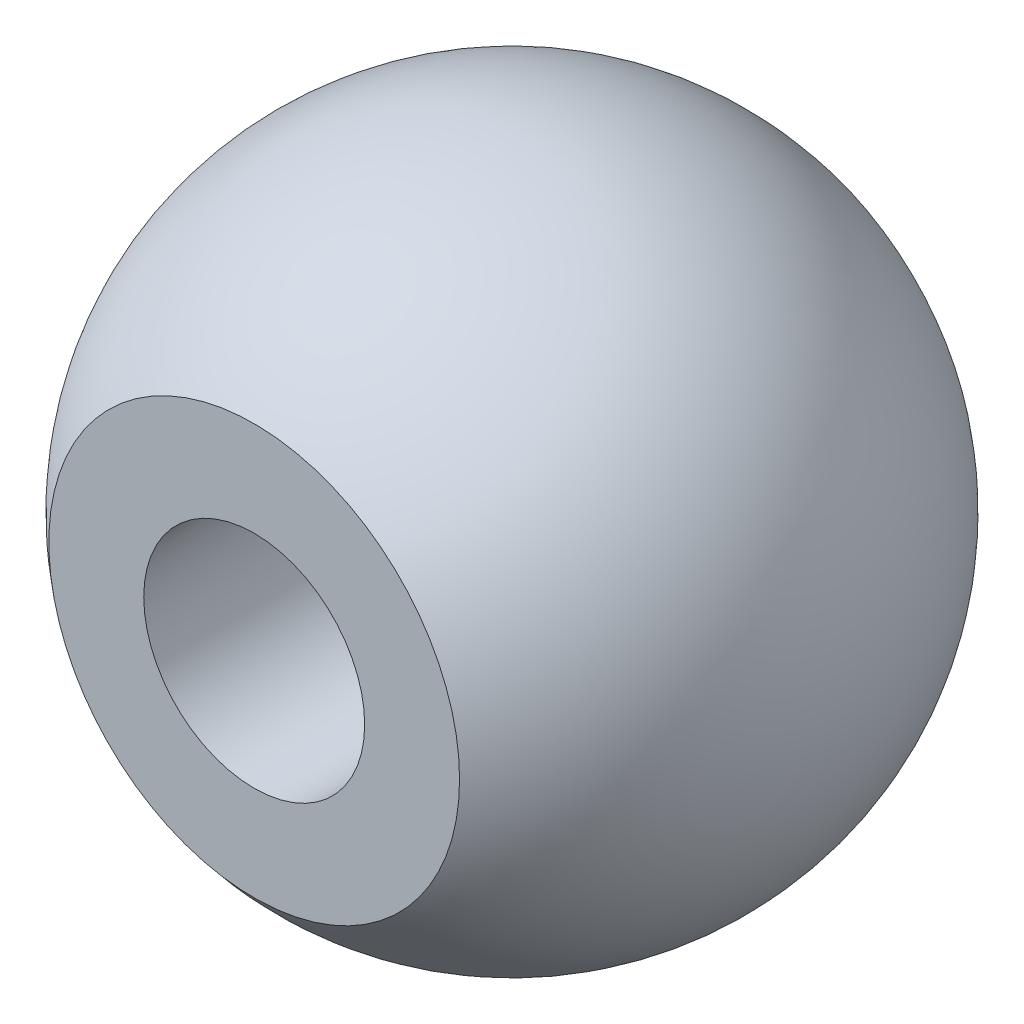
ISO-10303-21;
HEADER;
FILE_DESCRIPTION(('STEP AP214'),'2;1');
FILE_NAME('part.step','',(''),(''),'','','');
FILE_SCHEMA(('AUTOMOTIVE_DESIGN { 1 0 10303 214 1 1 1 1 }'));
ENDSEC;
DATA;
#1=APPLICATION_CONTEXT('core data for automotive mechanical design processes');
#2=APPLICATION_PROTOCOL_DEFINITION('international standard','automotive_design',2000,#1);
#3=PRODUCT_CONTEXT('',#1,'mechanical');
#4=PRODUCT('Part','Part','',(#3));
#5=PRODUCT_RELATED_PRODUCT_CATEGORY('part','',(#4));
#6=PRODUCT_DEFINITION_FORMATION('','',#4);
#7=PRODUCT_DEFINITION_CONTEXT('part definition',#1,'design');
#8=PRODUCT_DEFINITION('design','',#6,#7);
#9=PRODUCT_DEFINITION_SHAPE('','',#8);
#10=(LENGTH_UNIT() NAMED_UNIT(*) SI_UNIT(.MILLI.,.METRE.));
#11=(NAMED_UNIT(*) PLANE_ANGLE_UNIT() SI_UNIT($,.RADIAN.));
#12=(NAMED_UNIT(*) SI_UNIT($,.STERADIAN.) SOLID_ANGLE_UNIT());
#13=UNCERTAINTY_MEASURE_WITH_UNIT(LENGTH_MEASURE(1.E-05),#10,'distance_accuracy_value','');
#14=(GEOMETRIC_REPRESENTATION_CONTEXT(3) GLOBAL_UNCERTAINTY_ASSIGNED_CONTEXT((#13)) GLOBAL_UNIT_ASSIGNED_CONTEXT((#10,
#11,#12)) REPRESENTATION_CONTEXT('',''));
#15=CARTESIAN_POINT('',(0.,0.,0.));
#16=DIRECTION('',(0.,0.,1.));
#17=DIRECTION('',(1.,0.,0.));
#18=AXIS2_PLACEMENT_3D('',#15,#16,#17);
#19=CARTESIAN_POINT('',(-15.,0.,-231.43));
#20=DIRECTION('',(0.,-1.,0.));
#21=DIRECTION('',(-1.,0.,0.));
#22=AXIS2_PLACEMENT_3D('',#19,#20,#21);
#23=SPHERICAL_SURFACE('',#22,17.9);
#24=CARTESIAN_POINT('',(-15.,0.,-231.43));
#25=DIRECTION('',(0.,0.,1.));
#26=DIRECTION('',(1.,0.,0.));
#27=AXIS2_PLACEMENT_3D('',#24,#25,#26);
#28=SPHERICAL_SURFACE('',#27,17.9);
#29=CARTESIAN_POINT('',(-15.,0.,-217.43));
#30=DIRECTION('',(0.,0.,1.));
#31=DIRECTION('',(1.,0.,0.));
#32=AXIS2_PLACEMENT_3D('',#29,#30,#31);
#33=CIRCLE('',#32,11.1539230766578);
#34=CARTESIAN_POINT('',(-3.84607692334219,0.,-217.43));
#35=VERTEX_POINT('',#34);
#36=EDGE_CURVE('E10',#35,#35,#33,.T.);
#37=ORIENTED_EDGE('',*,*,#36,.F.);
#38=EDGE_LOOP('',(#37));
#39=FACE_BOUND('',#38,.T.);
#40=CARTESIAN_POINT('',(-15.,0.,-245.43));
#41=DIRECTION('',(0.,0.,-1.));
#42=DIRECTION('',(-1.,0.,0.));
#43=AXIS2_PLACEMENT_3D('',#40,#41,#42);
#44=CIRCLE('',#43,11.1539230766578);
#45=CARTESIAN_POINT('',(-26.1539230766578,0.,-245.43));
#46=VERTEX_POINT('',#45);
#47=EDGE_CURVE('E38',#46,#46,#44,.T.);
#48=ORIENTED_EDGE('',*,*,#47,.F.);
#49=EDGE_LOOP('',(#48));
#50=FACE_BOUND('',#49,.T.);
#51=ADVANCED_FACE('F35',(#39,#50),#28,.T.);
#52=CARTESIAN_POINT('',(-15.,0.,-217.43));
#53=DIRECTION('',(0.,0.,1.));
#54=DIRECTION('',(1.,0.,0.));
#55=AXIS2_PLACEMENT_3D('',#52,#53,#54);
#56=PLANE('',#55);
#57=CARTESIAN_POINT('',(-15.,0.,-217.43));
#58=DIRECTION('',(0.,0.,1.));
#59=DIRECTION('',(1.,0.,0.));
#60=AXIS2_PLACEMENT_3D('',#57,#58,#59);
#61=CIRCLE('',#60,6.);
#62=CARTESIAN_POINT('',(-9.,0.,-217.43));
#63=VERTEX_POINT('',#62);
#64=EDGE_CURVE('E45',#63,#63,#61,.T.);
#65=ORIENTED_EDGE('',*,*,#64,.F.);
#66=EDGE_LOOP('',(#65));
#67=FACE_BOUND('',#66,.T.);
#68=ORIENTED_EDGE('',*,*,#36,.T.);
#69=EDGE_LOOP('',(#68));
#70=FACE_BOUND('',#69,.T.);
#71=ADVANCED_FACE('F58',(#67,#70),#56,.T.);
#72=CARTESIAN_POINT('',(-15.,0.,-245.43));
#73=DIRECTION('',(0.,0.,-1.));
#74=DIRECTION('',(1.,0.,0.));
#75=AXIS2_PLACEMENT_3D('',#72,#73,#74);
#76=PLANE('',#75);
#77=CARTESIAN_POINT('',(-15.,0.,-245.43));
#78=DIRECTION('',(0.,0.,-1.));
#79=DIRECTION('',(-1.,0.,0.));
#80=AXIS2_PLACEMENT_3D('',#77,#78,#79);
#81=CIRCLE('',#80,6.);
#82=CARTESIAN_POINT('',(-21.,0.,-245.43));
#83=VERTEX_POINT('',#82);
#84=EDGE_CURVE('E49',#83,#83,#81,.T.);
#85=ORIENTED_EDGE('',*,*,#84,.F.);
#86=EDGE_LOOP('',(#85));
#87=FACE_BOUND('',#86,.T.);
#88=ORIENTED_EDGE('',*,*,#47,.T.);
#89=EDGE_LOOP('',(#88));
#90=FACE_BOUND('',#89,.T.);
#91=ADVANCED_FACE('F55',(#87,#90),#76,.T.);
#92=CARTESIAN_POINT('',(-15.,0.,-209.43));
#93=DIRECTION('',(0.,0.,-1.));
#94=DIRECTION('',(-1.,0.,0.));
#95=AXIS2_PLACEMENT_3D('',#92,#93,#94);
#96=CYLINDRICAL_SURFACE('',#95,6.);
#97=ORIENTED_EDGE('',*,*,#64,.T.);
#98=EDGE_LOOP('',(#97));
#99=FACE_BOUND('',#98,.T.);
#100=ORIENTED_EDGE('',*,*,#84,.T.);
#101=EDGE_LOOP('',(#100));
#102=FACE_BOUND('',#101,.T.);
#103=ADVANCED_FACE('F53',(#99,#102),#96,.F.);
#104=CLOSED_SHELL('',(#51,#71,#91,#103));
#105=MANIFOLD_SOLID_BREP('B2',#104);
#106=ADVANCED_BREP_SHAPE_REPRESENTATION('',(#18,#105),#14);
#107=SHAPE_DEFINITION_REPRESENTATION(#9,#106);
ENDSEC;
END-ISO-10303-21;
